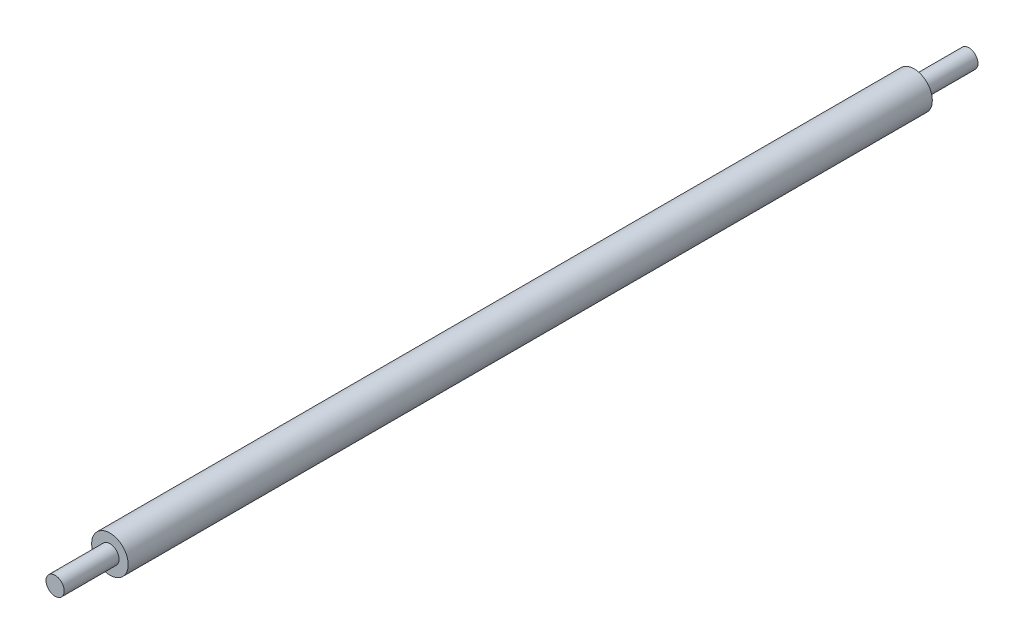
ISO-10303-21;
HEADER;
FILE_DESCRIPTION(('STEP AP214'),'2;1');
FILE_NAME('part.step','',(''),(''),'','','');
FILE_SCHEMA(('AUTOMOTIVE_DESIGN { 1 0 10303 214 1 1 1 1 }'));
ENDSEC;
DATA;
#1=APPLICATION_CONTEXT('core data for automotive mechanical design processes');
#2=APPLICATION_PROTOCOL_DEFINITION('international standard','automotive_design',2000,#1);
#3=PRODUCT_CONTEXT('',#1,'mechanical');
#4=PRODUCT('Part','Part','',(#3));
#5=PRODUCT_RELATED_PRODUCT_CATEGORY('part','',(#4));
#6=PRODUCT_DEFINITION_FORMATION('','',#4);
#7=PRODUCT_DEFINITION_CONTEXT('part definition',#1,'design');
#8=PRODUCT_DEFINITION('design','',#6,#7);
#9=PRODUCT_DEFINITION_SHAPE('','',#8);
#10=(LENGTH_UNIT() NAMED_UNIT(*) SI_UNIT(.MILLI.,.METRE.));
#11=(NAMED_UNIT(*) PLANE_ANGLE_UNIT() SI_UNIT($,.RADIAN.));
#12=(NAMED_UNIT(*) SI_UNIT($,.STERADIAN.) SOLID_ANGLE_UNIT());
#13=UNCERTAINTY_MEASURE_WITH_UNIT(LENGTH_MEASURE(1.E-05),#10,'distance_accuracy_value','');
#14=(GEOMETRIC_REPRESENTATION_CONTEXT(3) GLOBAL_UNCERTAINTY_ASSIGNED_CONTEXT((#13)) GLOBAL_UNIT_ASSIGNED_CONTEXT((#10,
#11,#12)) REPRESENTATION_CONTEXT('',''));
#15=CARTESIAN_POINT('',(0.,0.,0.));
#16=DIRECTION('',(0.,0.,1.));
#17=DIRECTION('',(1.,0.,0.));
#18=AXIS2_PLACEMENT_3D('',#15,#16,#17);
#19=CARTESIAN_POINT('',(0.,0.,2.5));
#20=DIRECTION('',(0.,0.,-1.));
#21=DIRECTION('',(-1.,0.,0.));
#22=AXIS2_PLACEMENT_3D('',#19,#20,#21);
#23=CYLINDRICAL_SURFACE('',#22,0.05);
#24=CARTESIAN_POINT('',(0.,0.,0.15));
#25=DIRECTION('',(0.,0.,1.));
#26=DIRECTION('',(1.,0.,0.));
#27=AXIS2_PLACEMENT_3D('',#24,#25,#26);
#28=CIRCLE('',#27,0.05);
#29=CARTESIAN_POINT('',(0.05,0.,0.15));
#30=VERTEX_POINT('',#29);
#31=EDGE_CURVE('E46',#30,#30,#28,.T.);
#32=ORIENTED_EDGE('',*,*,#31,.T.);
#33=EDGE_LOOP('',(#32));
#34=FACE_BOUND('',#33,.T.);
#35=CARTESIAN_POINT('',(0.,0.,2.35));
#36=DIRECTION('',(0.,0.,1.));
#37=DIRECTION('',(1.,0.,0.));
#38=AXIS2_PLACEMENT_3D('',#35,#36,#37);
#39=CIRCLE('',#38,0.05);
#40=CARTESIAN_POINT('',(0.05,0.,2.35));
#41=VERTEX_POINT('',#40);
#42=EDGE_CURVE('E60',#41,#41,#39,.T.);
#43=ORIENTED_EDGE('',*,*,#42,.F.);
#44=EDGE_LOOP('',(#43));
#45=FACE_BOUND('',#44,.T.);
#46=ADVANCED_FACE('F43',(#34,#45),#23,.T.);
#47=CARTESIAN_POINT('',(0.,0.,0.15));
#48=DIRECTION('',(0.,0.,1.));
#49=DIRECTION('',(1.,0.,0.));
#50=AXIS2_PLACEMENT_3D('',#47,#48,#49);
#51=PLANE('',#50);
#52=CARTESIAN_POINT('',(0.,0.,0.15));
#53=DIRECTION('',(0.,0.,1.));
#54=DIRECTION('',(1.,0.,0.));
#55=AXIS2_PLACEMENT_3D('',#52,#53,#54);
#56=CIRCLE('',#55,0.025);
#57=CARTESIAN_POINT('',(0.025,0.,0.15));
#58=VERTEX_POINT('',#57);
#59=EDGE_CURVE('E64',#58,#58,#56,.T.);
#60=ORIENTED_EDGE('',*,*,#59,.T.);
#61=EDGE_LOOP('',(#60));
#62=FACE_BOUND('',#61,.T.);
#63=ORIENTED_EDGE('',*,*,#31,.F.);
#64=EDGE_LOOP('',(#63));
#65=FACE_BOUND('',#64,.T.);
#66=ADVANCED_FACE('F71',(#62,#65),#51,.F.);
#67=CARTESIAN_POINT('',(0.,0.,0.));
#68=DIRECTION('',(0.,0.,1.));
#69=DIRECTION('',(1.,0.,0.));
#70=AXIS2_PLACEMENT_3D('',#67,#68,#69);
#71=CYLINDRICAL_SURFACE('',#70,0.025);
#72=CARTESIAN_POINT('',(0.,0.,0.));
#73=DIRECTION('',(0.,0.,1.));
#74=DIRECTION('',(1.,0.,0.));
#75=AXIS2_PLACEMENT_3D('',#72,#73,#74);
#76=CIRCLE('',#75,0.025);
#77=CARTESIAN_POINT('',(0.025,0.,0.));
#78=VERTEX_POINT('',#77);
#79=EDGE_CURVE('E56',#78,#78,#76,.T.);
#80=ORIENTED_EDGE('',*,*,#79,.T.);
#81=EDGE_LOOP('',(#80));
#82=FACE_BOUND('',#81,.T.);
#83=ORIENTED_EDGE('',*,*,#59,.F.);
#84=EDGE_LOOP('',(#83));
#85=FACE_BOUND('',#84,.T.);
#86=ADVANCED_FACE('F74',(#82,#85),#71,.T.);
#87=CARTESIAN_POINT('',(0.,0.,0.));
#88=DIRECTION('',(0.,0.,1.));
#89=DIRECTION('',(1.,0.,0.));
#90=AXIS2_PLACEMENT_3D('',#87,#88,#89);
#91=PLANE('',#90);
#92=ORIENTED_EDGE('',*,*,#79,.F.);
#93=EDGE_LOOP('',(#92));
#94=FACE_BOUND('',#93,.T.);
#95=ADVANCED_FACE('F76',(#94),#91,.F.);
#96=CARTESIAN_POINT('',(0.,0.,2.35));
#97=DIRECTION('',(0.,0.,1.));
#98=DIRECTION('',(1.,0.,0.));
#99=AXIS2_PLACEMENT_3D('',#96,#97,#98);
#100=PLANE('',#99);
#101=CARTESIAN_POINT('',(0.,0.,2.35));
#102=DIRECTION('',(0.,0.,1.));
#103=DIRECTION('',(1.,0.,0.));
#104=AXIS2_PLACEMENT_3D('',#101,#102,#103);
#105=CIRCLE('',#104,0.0249516549249796);
#106=CARTESIAN_POINT('',(0.0249516549249796,0.,2.35));
#107=VERTEX_POINT('',#106);
#108=EDGE_CURVE('E10',#107,#107,#105,.T.);
#109=ORIENTED_EDGE('',*,*,#108,.F.);
#110=EDGE_LOOP('',(#109));
#111=FACE_BOUND('',#110,.T.);
#112=ORIENTED_EDGE('',*,*,#42,.T.);
#113=EDGE_LOOP('',(#112));
#114=FACE_BOUND('',#113,.T.);
#115=ADVANCED_FACE('F83',(#111,#114),#100,.T.);
#116=CARTESIAN_POINT('',(0.,0.,2.5));
#117=DIRECTION('',(0.,0.,-1.));
#118=DIRECTION('',(-1.,0.,0.));
#119=AXIS2_PLACEMENT_3D('',#116,#117,#118);
#120=CYLINDRICAL_SURFACE('',#119,0.0249516549249796);
#121=CARTESIAN_POINT('',(0.,0.,2.5));
#122=DIRECTION('',(0.,0.,1.));
#123=DIRECTION('',(1.,0.,0.));
#124=AXIS2_PLACEMENT_3D('',#121,#122,#123);
#125=CIRCLE('',#124,0.0249516549249796);
#126=CARTESIAN_POINT('',(0.0249516549249796,0.,2.5));
#127=VERTEX_POINT('',#126);
#128=EDGE_CURVE('E59',#127,#127,#125,.T.);
#129=ORIENTED_EDGE('',*,*,#128,.F.);
#130=EDGE_LOOP('',(#129));
#131=FACE_BOUND('',#130,.T.);
#132=ORIENTED_EDGE('',*,*,#108,.T.);
#133=EDGE_LOOP('',(#132));
#134=FACE_BOUND('',#133,.T.);
#135=ADVANCED_FACE('F95',(#131,#134),#120,.T.);
#136=CARTESIAN_POINT('',(0.,0.,2.5));
#137=DIRECTION('',(0.,0.,1.));
#138=DIRECTION('',(1.,0.,0.));
#139=AXIS2_PLACEMENT_3D('',#136,#137,#138);
#140=PLANE('',#139);
#141=ORIENTED_EDGE('',*,*,#128,.T.);
#142=EDGE_LOOP('',(#141));
#143=FACE_BOUND('',#142,.T.);
#144=ADVANCED_FACE('F101',(#143),#140,.T.);
#145=CLOSED_SHELL('',(#46,#66,#86,#95,#115,#135,#144));
#146=MANIFOLD_SOLID_BREP('B2',#145);
#147=ADVANCED_BREP_SHAPE_REPRESENTATION('',(#18,#146),#14);
#148=SHAPE_DEFINITION_REPRESENTATION(#9,#147);
ENDSEC;
END-ISO-10303-21;
